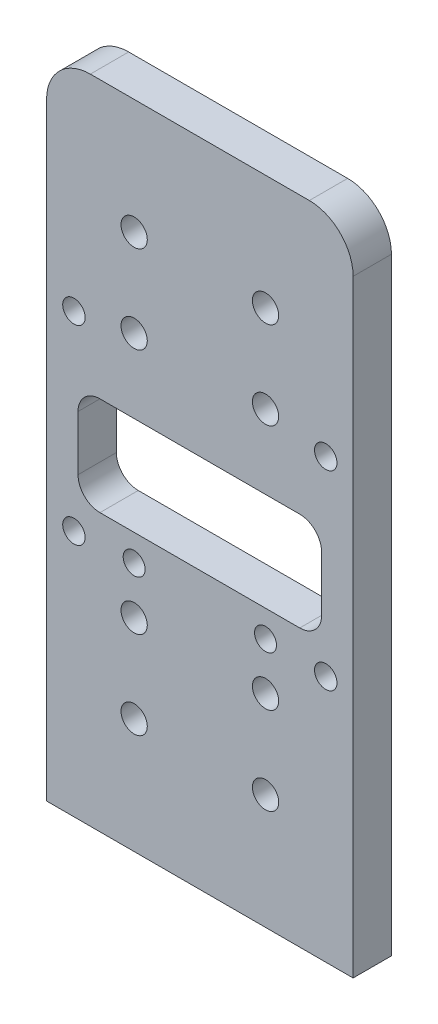
ISO-10303-21;
HEADER;
FILE_DESCRIPTION(('STEP AP214'),'2;1');
FILE_NAME('part.step','',(''),(''),'','','');
FILE_SCHEMA(('AUTOMOTIVE_DESIGN { 1 0 10303 214 1 1 1 1 }'));
ENDSEC;
DATA;
#1=APPLICATION_CONTEXT('core data for automotive mechanical design processes');
#2=APPLICATION_PROTOCOL_DEFINITION('international standard','automotive_design',2000,#1);
#3=PRODUCT_CONTEXT('',#1,'mechanical');
#4=PRODUCT('Part','Part','',(#3));
#5=PRODUCT_RELATED_PRODUCT_CATEGORY('part','',(#4));
#6=PRODUCT_DEFINITION_FORMATION('','',#4);
#7=PRODUCT_DEFINITION_CONTEXT('part definition',#1,'design');
#8=PRODUCT_DEFINITION('design','',#6,#7);
#9=PRODUCT_DEFINITION_SHAPE('','',#8);
#10=(LENGTH_UNIT() NAMED_UNIT(*) SI_UNIT(.MILLI.,.METRE.));
#11=(NAMED_UNIT(*) PLANE_ANGLE_UNIT() SI_UNIT($,.RADIAN.));
#12=(NAMED_UNIT(*) SI_UNIT($,.STERADIAN.) SOLID_ANGLE_UNIT());
#13=UNCERTAINTY_MEASURE_WITH_UNIT(LENGTH_MEASURE(1.E-05),#10,'distance_accuracy_value','');
#14=(GEOMETRIC_REPRESENTATION_CONTEXT(3) GLOBAL_UNCERTAINTY_ASSIGNED_CONTEXT((#13)) GLOBAL_UNIT_ASSIGNED_CONTEXT((#10,
#11,#12)) REPRESENTATION_CONTEXT('',''));
#15=CARTESIAN_POINT('',(0.,0.,0.));
#16=DIRECTION('',(0.,0.,1.));
#17=DIRECTION('',(1.,0.,0.));
#18=AXIS2_PLACEMENT_3D('',#15,#16,#17);
#19=CARTESIAN_POINT('',(28.,0.,3.5));
#20=DIRECTION('',(-1.,0.,0.));
#21=DIRECTION('',(0.,0.,1.));
#22=AXIS2_PLACEMENT_3D('',#19,#20,#21);
#23=PLANE('',#22);
#24=DIRECTION('',(0.,1.,0.));
#25=VECTOR('',#24,1.);
#26=CARTESIAN_POINT('',(28.,0.,0.));
#27=LINE('',#26,#25);
#28=CARTESIAN_POINT('',(28.,0.,0.));
#29=VERTEX_POINT('',#28);
#30=CARTESIAN_POINT('',(28.,55.5,0.));
#31=VERTEX_POINT('',#30);
#32=EDGE_CURVE('E275',#29,#31,#27,.T.);
#33=ORIENTED_EDGE('',*,*,#32,.T.);
#34=DIRECTION('',(0.,0.,-1.));
#35=VECTOR('',#34,1.);
#36=CARTESIAN_POINT('',(28.,55.5,3.5));
#37=LINE('',#36,#35);
#38=CARTESIAN_POINT('',(28.,55.5,3.5));
#39=VERTEX_POINT('',#38);
#40=EDGE_CURVE('E11',#39,#31,#37,.T.);
#41=ORIENTED_EDGE('',*,*,#40,.F.);
#42=DIRECTION('',(0.,1.,0.));
#43=VECTOR('',#42,1.);
#44=CARTESIAN_POINT('',(28.,0.,3.5));
#45=LINE('',#44,#43);
#46=CARTESIAN_POINT('',(28.,0.,3.5));
#47=VERTEX_POINT('',#46);
#48=EDGE_CURVE('E278',#47,#39,#45,.T.);
#49=ORIENTED_EDGE('',*,*,#48,.F.);
#50=DIRECTION('',(0.,0.,-1.));
#51=VECTOR('',#50,1.);
#52=CARTESIAN_POINT('',(28.,0.,3.5));
#53=LINE('',#52,#51);
#54=EDGE_CURVE('E292',#47,#29,#53,.T.);
#55=ORIENTED_EDGE('',*,*,#54,.T.);
#56=EDGE_LOOP('',(#33,#41,#49,#55));
#57=FACE_BOUND('',#56,.T.);
#58=ADVANCED_FACE('F33',(#57),#23,.F.);
#59=CARTESIAN_POINT('',(24.,55.5,3.5));
#60=DIRECTION('',(0.,0.,-1.));
#61=DIRECTION('',(-1.,0.,0.));
#62=AXIS2_PLACEMENT_3D('',#59,#60,#61);
#63=CYLINDRICAL_SURFACE('',#62,4.);
#64=CARTESIAN_POINT('',(24.,55.5,0.));
#65=DIRECTION('',(0.,0.,1.));
#66=DIRECTION('',(-1.,0.,0.));
#67=AXIS2_PLACEMENT_3D('',#64,#65,#66);
#68=CIRCLE('',#67,4.);
#69=CARTESIAN_POINT('',(24.,59.5,0.));
#70=VERTEX_POINT('',#69);
#71=EDGE_CURVE('E295',#31,#70,#68,.T.);
#72=ORIENTED_EDGE('',*,*,#71,.T.);
#73=DIRECTION('',(0.,0.,-1.));
#74=VECTOR('',#73,1.);
#75=CARTESIAN_POINT('',(24.,59.5,3.5));
#76=LINE('',#75,#74);
#77=CARTESIAN_POINT('',(24.,59.5,3.5));
#78=VERTEX_POINT('',#77);
#79=EDGE_CURVE('E40',#78,#70,#76,.T.);
#80=ORIENTED_EDGE('',*,*,#79,.F.);
#81=CARTESIAN_POINT('',(24.,55.5,3.5));
#82=DIRECTION('',(0.,0.,1.));
#83=DIRECTION('',(-1.,0.,0.));
#84=AXIS2_PLACEMENT_3D('',#81,#82,#83);
#85=CIRCLE('',#84,4.);
#86=EDGE_CURVE('E281',#39,#78,#85,.T.);
#87=ORIENTED_EDGE('',*,*,#86,.F.);
#88=ORIENTED_EDGE('',*,*,#40,.T.);
#89=EDGE_LOOP('',(#72,#80,#87,#88));
#90=FACE_BOUND('',#89,.T.);
#91=ADVANCED_FACE('F341',(#90),#63,.T.);
#92=CARTESIAN_POINT('',(4.00000000000003,59.5,3.5));
#93=DIRECTION('',(0.,-1.,0.));
#94=DIRECTION('',(0.,0.,-1.));
#95=AXIS2_PLACEMENT_3D('',#92,#93,#94);
#96=PLANE('',#95);
#97=DIRECTION('',(-1.,0.,0.));
#98=VECTOR('',#97,1.);
#99=CARTESIAN_POINT('',(4.00000000000003,59.5,0.));
#100=LINE('',#99,#98);
#101=CARTESIAN_POINT('',(4.00000000000003,59.5,0.));
#102=VERTEX_POINT('',#101);
#103=EDGE_CURVE('E297',#70,#102,#100,.T.);
#104=ORIENTED_EDGE('',*,*,#103,.T.);
#105=DIRECTION('',(0.,0.,-1.));
#106=VECTOR('',#105,1.);
#107=CARTESIAN_POINT('',(4.00000000000003,59.5,3.5));
#108=LINE('',#107,#106);
#109=CARTESIAN_POINT('',(4.00000000000003,59.5,3.5));
#110=VERTEX_POINT('',#109);
#111=EDGE_CURVE('E312',#110,#102,#108,.T.);
#112=ORIENTED_EDGE('',*,*,#111,.F.);
#113=DIRECTION('',(-1.,0.,0.));
#114=VECTOR('',#113,1.);
#115=CARTESIAN_POINT('',(4.00000000000003,59.5,3.5));
#116=LINE('',#115,#114);
#117=EDGE_CURVE('E284',#78,#110,#116,.T.);
#118=ORIENTED_EDGE('',*,*,#117,.F.);
#119=ORIENTED_EDGE('',*,*,#79,.T.);
#120=EDGE_LOOP('',(#104,#112,#118,#119));
#121=FACE_BOUND('',#120,.T.);
#122=ADVANCED_FACE('F319',(#121),#96,.F.);
#123=CARTESIAN_POINT('',(4.,55.5,3.5));
#124=DIRECTION('',(0.,0.,-1.));
#125=DIRECTION('',(-1.,0.,0.));
#126=AXIS2_PLACEMENT_3D('',#123,#124,#125);
#127=CYLINDRICAL_SURFACE('',#126,4.);
#128=CARTESIAN_POINT('',(4.,55.5,0.));
#129=DIRECTION('',(0.,0.,1.));
#130=DIRECTION('',(-1.,0.,0.));
#131=AXIS2_PLACEMENT_3D('',#128,#129,#130);
#132=CIRCLE('',#131,4.);
#133=CARTESIAN_POINT('',(0.,55.5,0.));
#134=VERTEX_POINT('',#133);
#135=EDGE_CURVE('E299',#102,#134,#132,.T.);
#136=ORIENTED_EDGE('',*,*,#135,.T.);
#137=DIRECTION('',(0.,0.,-1.));
#138=VECTOR('',#137,1.);
#139=CARTESIAN_POINT('',(0.,55.5,3.5));
#140=LINE('',#139,#138);
#141=CARTESIAN_POINT('',(0.,55.5,3.5));
#142=VERTEX_POINT('',#141);
#143=EDGE_CURVE('E309',#142,#134,#140,.T.);
#144=ORIENTED_EDGE('',*,*,#143,.F.);
#145=CARTESIAN_POINT('',(4.,55.5,3.5));
#146=DIRECTION('',(0.,0.,1.));
#147=DIRECTION('',(-1.,0.,0.));
#148=AXIS2_PLACEMENT_3D('',#145,#146,#147);
#149=CIRCLE('',#148,4.);
#150=EDGE_CURVE('E286',#110,#142,#149,.T.);
#151=ORIENTED_EDGE('',*,*,#150,.F.);
#152=ORIENTED_EDGE('',*,*,#111,.T.);
#153=EDGE_LOOP('',(#136,#144,#151,#152));
#154=FACE_BOUND('',#153,.T.);
#155=ADVANCED_FACE('F329',(#154),#127,.T.);
#156=CARTESIAN_POINT('',(0.,0.,3.5));
#157=DIRECTION('',(1.,0.,0.));
#158=DIRECTION('',(0.,0.,-1.));
#159=AXIS2_PLACEMENT_3D('',#156,#157,#158);
#160=PLANE('',#159);
#161=DIRECTION('',(0.,-1.,0.));
#162=VECTOR('',#161,1.);
#163=CARTESIAN_POINT('',(0.,0.,0.));
#164=LINE('',#163,#162);
#165=CARTESIAN_POINT('',(0.,0.,0.));
#166=VERTEX_POINT('',#165);
#167=EDGE_CURVE('E301',#134,#166,#164,.T.);
#168=ORIENTED_EDGE('',*,*,#167,.T.);
#169=DIRECTION('',(0.,0.,-1.));
#170=VECTOR('',#169,1.);
#171=CARTESIAN_POINT('',(0.,0.,3.5));
#172=LINE('',#171,#170);
#173=CARTESIAN_POINT('',(0.,0.,3.5));
#174=VERTEX_POINT('',#173);
#175=EDGE_CURVE('E306',#174,#166,#172,.T.);
#176=ORIENTED_EDGE('',*,*,#175,.F.);
#177=DIRECTION('',(0.,-1.,0.));
#178=VECTOR('',#177,1.);
#179=CARTESIAN_POINT('',(0.,0.,3.5));
#180=LINE('',#179,#178);
#181=EDGE_CURVE('E288',#142,#174,#180,.T.);
#182=ORIENTED_EDGE('',*,*,#181,.F.);
#183=ORIENTED_EDGE('',*,*,#143,.T.);
#184=EDGE_LOOP('',(#168,#176,#182,#183));
#185=FACE_BOUND('',#184,.T.);
#186=ADVANCED_FACE('F333',(#185),#160,.F.);
#187=CARTESIAN_POINT('',(0.,0.,3.5));
#188=DIRECTION('',(0.,1.,0.));
#189=DIRECTION('',(0.,0.,1.));
#190=AXIS2_PLACEMENT_3D('',#187,#188,#189);
#191=PLANE('',#190);
#192=DIRECTION('',(1.,0.,0.));
#193=VECTOR('',#192,1.);
#194=CARTESIAN_POINT('',(0.,0.,0.));
#195=LINE('',#194,#193);
#196=EDGE_CURVE('E282',#166,#29,#195,.T.);
#197=ORIENTED_EDGE('',*,*,#196,.T.);
#198=ORIENTED_EDGE('',*,*,#54,.F.);
#199=DIRECTION('',(1.,0.,0.));
#200=VECTOR('',#199,1.);
#201=CARTESIAN_POINT('',(0.,0.,3.5));
#202=LINE('',#201,#200);
#203=EDGE_CURVE('E290',#174,#47,#202,.T.);
#204=ORIENTED_EDGE('',*,*,#203,.F.);
#205=ORIENTED_EDGE('',*,*,#175,.T.);
#206=EDGE_LOOP('',(#197,#198,#204,#205));
#207=FACE_BOUND('',#206,.T.);
#208=ADVANCED_FACE('F344',(#207),#191,.F.);
#209=CARTESIAN_POINT('',(24.,55.5,3.5));
#210=DIRECTION('',(0.,0.,-1.));
#211=DIRECTION('',(-1.,0.,0.));
#212=AXIS2_PLACEMENT_3D('',#209,#210,#211);
#213=PLANE('',#212);
#214=CARTESIAN_POINT('',(20.,22.82,3.5));
#215=DIRECTION('',(0.,0.,1.));
#216=DIRECTION('',(1.,0.,0.));
#217=AXIS2_PLACEMENT_3D('',#214,#215,#216);
#218=CIRCLE('',#217,1.);
#219=CARTESIAN_POINT('',(21.,22.82,3.5));
#220=VERTEX_POINT('',#219);
#221=EDGE_CURVE('E616',#220,#220,#218,.T.);
#222=ORIENTED_EDGE('',*,*,#221,.F.);
#223=EDGE_LOOP('',(#222));
#224=FACE_BOUND('',#223,.T.);
#225=CARTESIAN_POINT('',(8.,22.82,3.5));
#226=DIRECTION('',(0.,0.,1.));
#227=DIRECTION('',(1.,0.,0.));
#228=AXIS2_PLACEMENT_3D('',#225,#226,#227);
#229=CIRCLE('',#228,1.);
#230=CARTESIAN_POINT('',(9.,22.82,3.5));
#231=VERTEX_POINT('',#230);
#232=EDGE_CURVE('E158',#231,#231,#229,.T.);
#233=ORIENTED_EDGE('',*,*,#232,.F.);
#234=EDGE_LOOP('',(#233));
#235=FACE_BOUND('',#234,.T.);
#236=DIRECTION('',(-1.,0.,0.));
#237=VECTOR('',#236,1.);
#238=CARTESIAN_POINT('',(4.87500000000002,34.25,3.5));
#239=LINE('',#238,#237);
#240=CARTESIAN_POINT('',(23.125,34.25,3.5));
#241=VERTEX_POINT('',#240);
#242=CARTESIAN_POINT('',(4.87500000000002,34.25,3.5));
#243=VERTEX_POINT('',#242);
#244=EDGE_CURVE('E175',#241,#243,#239,.T.);
#245=ORIENTED_EDGE('',*,*,#244,.F.);
#246=CARTESIAN_POINT('',(23.125,32.25,3.5));
#247=DIRECTION('',(0.,0.,1.));
#248=DIRECTION('',(1.,0.,0.));
#249=AXIS2_PLACEMENT_3D('',#246,#247,#248);
#250=CIRCLE('',#249,2.);
#251=CARTESIAN_POINT('',(25.125,32.25,3.5));
#252=VERTEX_POINT('',#251);
#253=EDGE_CURVE('E47',#252,#241,#250,.T.);
#254=ORIENTED_EDGE('',*,*,#253,.F.);
#255=DIRECTION('',(0.,1.,0.));
#256=VECTOR('',#255,1.);
#257=CARTESIAN_POINT('',(25.125,32.25,3.5));
#258=LINE('',#257,#256);
#259=CARTESIAN_POINT('',(25.125,27.25,3.5));
#260=VERTEX_POINT('',#259);
#261=EDGE_CURVE('E152',#260,#252,#258,.T.);
#262=ORIENTED_EDGE('',*,*,#261,.F.);
#263=CARTESIAN_POINT('',(23.125,27.25,3.5));
#264=DIRECTION('',(0.,0.,1.));
#265=DIRECTION('',(-1.,0.,0.));
#266=AXIS2_PLACEMENT_3D('',#263,#264,#265);
#267=CIRCLE('',#266,2.);
#268=CARTESIAN_POINT('',(23.125,25.25,3.5));
#269=VERTEX_POINT('',#268);
#270=EDGE_CURVE('E155',#269,#260,#267,.T.);
#271=ORIENTED_EDGE('',*,*,#270,.F.);
#272=DIRECTION('',(1.,0.,0.));
#273=VECTOR('',#272,1.);
#274=CARTESIAN_POINT('',(4.87500000000002,25.25,3.5));
#275=LINE('',#274,#273);
#276=CARTESIAN_POINT('',(4.87500000000002,25.25,3.5));
#277=VERTEX_POINT('',#276);
#278=EDGE_CURVE('E187',#277,#269,#275,.T.);
#279=ORIENTED_EDGE('',*,*,#278,.F.);
#280=CARTESIAN_POINT('',(4.87500000000001,27.25,3.5));
#281=DIRECTION('',(0.,0.,1.));
#282=DIRECTION('',(1.,0.,0.));
#283=AXIS2_PLACEMENT_3D('',#280,#281,#282);
#284=CIRCLE('',#283,2.);
#285=CARTESIAN_POINT('',(2.87500000000001,27.25,3.5));
#286=VERTEX_POINT('',#285);
#287=EDGE_CURVE('E184',#286,#277,#284,.T.);
#288=ORIENTED_EDGE('',*,*,#287,.F.);
#289=DIRECTION('',(0.,-1.,0.));
#290=VECTOR('',#289,1.);
#291=CARTESIAN_POINT('',(2.87500000000001,32.25,3.5));
#292=LINE('',#291,#290);
#293=CARTESIAN_POINT('',(2.87500000000001,32.25,3.5));
#294=VERTEX_POINT('',#293);
#295=EDGE_CURVE('E181',#294,#286,#292,.T.);
#296=ORIENTED_EDGE('',*,*,#295,.F.);
#297=CARTESIAN_POINT('',(4.87500000000001,32.25,3.5));
#298=DIRECTION('',(0.,0.,1.));
#299=DIRECTION('',(1.,0.,0.));
#300=AXIS2_PLACEMENT_3D('',#297,#298,#299);
#301=CIRCLE('',#300,2.);
#302=EDGE_CURVE('E178',#243,#294,#301,.T.);
#303=ORIENTED_EDGE('',*,*,#302,.F.);
#304=EDGE_LOOP('',(#245,#254,#262,#271,#279,#288,#296,#303));
#305=FACE_BOUND('',#304,.T.);
#306=CARTESIAN_POINT('',(20.,49.,3.5));
#307=DIRECTION('',(0.,0.,1.));
#308=DIRECTION('',(1.,0.,0.));
#309=AXIS2_PLACEMENT_3D('',#306,#307,#308);
#310=CIRCLE('',#309,1.2);
#311=CARTESIAN_POINT('',(21.2,49.,3.5));
#312=VERTEX_POINT('',#311);
#313=EDGE_CURVE('E228',#312,#312,#310,.T.);
#314=ORIENTED_EDGE('',*,*,#313,.F.);
#315=EDGE_LOOP('',(#314));
#316=FACE_BOUND('',#315,.T.);
#317=CARTESIAN_POINT('',(20.,41.,3.5));
#318=DIRECTION('',(0.,0.,1.));
#319=DIRECTION('',(1.,0.,0.));
#320=AXIS2_PLACEMENT_3D('',#317,#318,#319);
#321=CIRCLE('',#320,1.2);
#322=CARTESIAN_POINT('',(21.2,41.,3.5));
#323=VERTEX_POINT('',#322);
#324=EDGE_CURVE('E234',#323,#323,#321,.T.);
#325=ORIENTED_EDGE('',*,*,#324,.F.);
#326=EDGE_LOOP('',(#325));
#327=FACE_BOUND('',#326,.T.);
#328=CARTESIAN_POINT('',(2.5,40.,3.5));
#329=DIRECTION('',(0.,0.,1.));
#330=DIRECTION('',(1.,0.,0.));
#331=AXIS2_PLACEMENT_3D('',#328,#329,#330);
#332=CIRCLE('',#331,1.025);
#333=CARTESIAN_POINT('',(3.525,40.,3.5));
#334=VERTEX_POINT('',#333);
#335=EDGE_CURVE('E209',#334,#334,#332,.T.);
#336=ORIENTED_EDGE('',*,*,#335,.F.);
#337=EDGE_LOOP('',(#336));
#338=FACE_BOUND('',#337,.T.);
#339=CARTESIAN_POINT('',(2.50000000000001,22.6,3.5));
#340=DIRECTION('',(0.,0.,1.));
#341=DIRECTION('',(1.,0.,0.));
#342=AXIS2_PLACEMENT_3D('',#339,#340,#341);
#343=CIRCLE('',#342,1.025);
#344=CARTESIAN_POINT('',(3.52500000000001,22.6,3.5));
#345=VERTEX_POINT('',#344);
#346=EDGE_CURVE('E210',#345,#345,#343,.T.);
#347=ORIENTED_EDGE('',*,*,#346,.F.);
#348=EDGE_LOOP('',(#347));
#349=FACE_BOUND('',#348,.T.);
#350=CARTESIAN_POINT('',(25.5,40.,3.5));
#351=DIRECTION('',(0.,0.,1.));
#352=DIRECTION('',(1.,0.,0.));
#353=AXIS2_PLACEMENT_3D('',#350,#351,#352);
#354=CIRCLE('',#353,1.025);
#355=CARTESIAN_POINT('',(26.525,40.,3.5));
#356=VERTEX_POINT('',#355);
#357=EDGE_CURVE('E216',#356,#356,#354,.T.);
#358=ORIENTED_EDGE('',*,*,#357,.F.);
#359=EDGE_LOOP('',(#358));
#360=FACE_BOUND('',#359,.T.);
#361=CARTESIAN_POINT('',(25.5,22.6,3.5));
#362=DIRECTION('',(0.,0.,1.));
#363=DIRECTION('',(1.,0.,0.));
#364=AXIS2_PLACEMENT_3D('',#361,#362,#363);
#365=CIRCLE('',#364,1.025);
#366=CARTESIAN_POINT('',(26.525,22.6,3.5));
#367=VERTEX_POINT('',#366);
#368=EDGE_CURVE('E194',#367,#367,#365,.T.);
#369=ORIENTED_EDGE('',*,*,#368,.F.);
#370=EDGE_LOOP('',(#369));
#371=FACE_BOUND('',#370,.T.);
#372=CARTESIAN_POINT('',(20.,10.5,3.5));
#373=DIRECTION('',(0.,0.,1.));
#374=DIRECTION('',(1.,0.,0.));
#375=AXIS2_PLACEMENT_3D('',#372,#373,#374);
#376=CIRCLE('',#375,1.2);
#377=CARTESIAN_POINT('',(21.2,10.5,3.5));
#378=VERTEX_POINT('',#377);
#379=EDGE_CURVE('E264',#378,#378,#376,.T.);
#380=ORIENTED_EDGE('',*,*,#379,.F.);
#381=EDGE_LOOP('',(#380));
#382=FACE_BOUND('',#381,.T.);
#383=CARTESIAN_POINT('',(8.,18.5,3.5));
#384=DIRECTION('',(0.,0.,1.));
#385=DIRECTION('',(1.,0.,0.));
#386=AXIS2_PLACEMENT_3D('',#383,#384,#385);
#387=CIRCLE('',#386,1.2);
#388=CARTESIAN_POINT('',(9.2,18.5,3.5));
#389=VERTEX_POINT('',#388);
#390=EDGE_CURVE('E245',#389,#389,#387,.T.);
#391=ORIENTED_EDGE('',*,*,#390,.F.);
#392=EDGE_LOOP('',(#391));
#393=FACE_BOUND('',#392,.T.);
#394=CARTESIAN_POINT('',(20.,18.5,3.5));
#395=DIRECTION('',(0.,0.,1.));
#396=DIRECTION('',(1.,0.,0.));
#397=AXIS2_PLACEMENT_3D('',#394,#395,#396);
#398=CIRCLE('',#397,1.2);
#399=CARTESIAN_POINT('',(21.2,18.5,3.5));
#400=VERTEX_POINT('',#399);
#401=EDGE_CURVE('E246',#400,#400,#398,.T.);
#402=ORIENTED_EDGE('',*,*,#401,.F.);
#403=EDGE_LOOP('',(#402));
#404=FACE_BOUND('',#403,.T.);
#405=CARTESIAN_POINT('',(8.,49.,3.5));
#406=DIRECTION('',(0.,0.,1.));
#407=DIRECTION('',(1.,0.,0.));
#408=AXIS2_PLACEMENT_3D('',#405,#406,#407);
#409=CIRCLE('',#408,1.2);
#410=CARTESIAN_POINT('',(9.2,49.,3.5));
#411=VERTEX_POINT('',#410);
#412=EDGE_CURVE('E252',#411,#411,#409,.T.);
#413=ORIENTED_EDGE('',*,*,#412,.F.);
#414=EDGE_LOOP('',(#413));
#415=FACE_BOUND('',#414,.T.);
#416=CARTESIAN_POINT('',(8.,41.,3.5));
#417=DIRECTION('',(0.,0.,1.));
#418=DIRECTION('',(1.,0.,0.));
#419=AXIS2_PLACEMENT_3D('',#416,#417,#418);
#420=CIRCLE('',#419,1.2);
#421=CARTESIAN_POINT('',(9.2,41.,3.5));
#422=VERTEX_POINT('',#421);
#423=EDGE_CURVE('E227',#422,#422,#420,.T.);
#424=ORIENTED_EDGE('',*,*,#423,.F.);
#425=EDGE_LOOP('',(#424));
#426=FACE_BOUND('',#425,.T.);
#427=CARTESIAN_POINT('',(8.,10.5,3.5));
#428=DIRECTION('',(0.,0.,1.));
#429=DIRECTION('',(1.,0.,0.));
#430=AXIS2_PLACEMENT_3D('',#427,#428,#429);
#431=CIRCLE('',#430,1.2);
#432=CARTESIAN_POINT('',(9.2,10.5,3.5));
#433=VERTEX_POINT('',#432);
#434=EDGE_CURVE('E263',#433,#433,#431,.T.);
#435=ORIENTED_EDGE('',*,*,#434,.F.);
#436=EDGE_LOOP('',(#435));
#437=FACE_BOUND('',#436,.T.);
#438=ORIENTED_EDGE('',*,*,#48,.T.);
#439=ORIENTED_EDGE('',*,*,#86,.T.);
#440=ORIENTED_EDGE('',*,*,#117,.T.);
#441=ORIENTED_EDGE('',*,*,#150,.T.);
#442=ORIENTED_EDGE('',*,*,#181,.T.);
#443=ORIENTED_EDGE('',*,*,#203,.T.);
#444=EDGE_LOOP('',(#438,#439,#440,#441,#442,#443));
#445=FACE_BOUND('',#444,.T.);
#446=ADVANCED_FACE('F337',(#224,#235,#305,#316,#327,#338,#349,#360,#371,#382,#393,#404,#415,
#426,#437,#445),#213,.F.);
#447=CARTESIAN_POINT('',(24.,55.5,0.));
#448=DIRECTION('',(0.,0.,-1.));
#449=DIRECTION('',(-1.,0.,0.));
#450=AXIS2_PLACEMENT_3D('',#447,#448,#449);
#451=PLANE('',#450);
#452=CARTESIAN_POINT('',(20.,22.82,0.));
#453=DIRECTION('',(0.,0.,1.));
#454=DIRECTION('',(1.,0.,0.));
#455=AXIS2_PLACEMENT_3D('',#452,#453,#454);
#456=CIRCLE('',#455,1.);
#457=CARTESIAN_POINT('',(21.,22.82,0.));
#458=VERTEX_POINT('',#457);
#459=EDGE_CURVE('E613',#458,#458,#456,.T.);
#460=ORIENTED_EDGE('',*,*,#459,.T.);
#461=EDGE_LOOP('',(#460));
#462=FACE_BOUND('',#461,.T.);
#463=CARTESIAN_POINT('',(8.,22.82,0.));
#464=DIRECTION('',(0.,0.,1.));
#465=DIRECTION('',(1.,0.,0.));
#466=AXIS2_PLACEMENT_3D('',#463,#464,#465);
#467=CIRCLE('',#466,1.);
#468=CARTESIAN_POINT('',(9.,22.82,0.));
#469=VERTEX_POINT('',#468);
#470=EDGE_CURVE('E176',#469,#469,#467,.T.);
#471=ORIENTED_EDGE('',*,*,#470,.T.);
#472=EDGE_LOOP('',(#471));
#473=FACE_BOUND('',#472,.T.);
#474=CARTESIAN_POINT('',(23.125,32.25,0.));
#475=DIRECTION('',(0.,0.,1.));
#476=DIRECTION('',(1.,0.,0.));
#477=AXIS2_PLACEMENT_3D('',#474,#475,#476);
#478=CIRCLE('',#477,2.);
#479=CARTESIAN_POINT('',(25.125,32.25,0.));
#480=VERTEX_POINT('',#479);
#481=CARTESIAN_POINT('',(23.125,34.25,0.));
#482=VERTEX_POINT('',#481);
#483=EDGE_CURVE('E135',#480,#482,#478,.T.);
#484=ORIENTED_EDGE('',*,*,#483,.T.);
#485=DIRECTION('',(-1.,0.,0.));
#486=VECTOR('',#485,1.);
#487=CARTESIAN_POINT('',(4.87500000000002,34.25,0.));
#488=LINE('',#487,#486);
#489=CARTESIAN_POINT('',(4.87500000000002,34.25,0.));
#490=VERTEX_POINT('',#489);
#491=EDGE_CURVE('E144',#482,#490,#488,.T.);
#492=ORIENTED_EDGE('',*,*,#491,.T.);
#493=CARTESIAN_POINT('',(4.87500000000001,32.25,0.));
#494=DIRECTION('',(0.,0.,1.));
#495=DIRECTION('',(1.,0.,0.));
#496=AXIS2_PLACEMENT_3D('',#493,#494,#495);
#497=CIRCLE('',#496,2.);
#498=CARTESIAN_POINT('',(2.87500000000001,32.25,0.));
#499=VERTEX_POINT('',#498);
#500=EDGE_CURVE('E55',#490,#499,#497,.T.);
#501=ORIENTED_EDGE('',*,*,#500,.T.);
#502=DIRECTION('',(0.,-1.,0.));
#503=VECTOR('',#502,1.);
#504=CARTESIAN_POINT('',(2.87500000000001,32.25,0.));
#505=LINE('',#504,#503);
#506=CARTESIAN_POINT('',(2.87500000000001,27.25,0.));
#507=VERTEX_POINT('',#506);
#508=EDGE_CURVE('E162',#499,#507,#505,.T.);
#509=ORIENTED_EDGE('',*,*,#508,.T.);
#510=CARTESIAN_POINT('',(4.87500000000001,27.25,0.));
#511=DIRECTION('',(0.,0.,1.));
#512=DIRECTION('',(1.,0.,0.));
#513=AXIS2_PLACEMENT_3D('',#510,#511,#512);
#514=CIRCLE('',#513,2.);
#515=CARTESIAN_POINT('',(4.87500000000002,25.25,0.));
#516=VERTEX_POINT('',#515);
#517=EDGE_CURVE('E165',#507,#516,#514,.T.);
#518=ORIENTED_EDGE('',*,*,#517,.T.);
#519=DIRECTION('',(1.,0.,0.));
#520=VECTOR('',#519,1.);
#521=CARTESIAN_POINT('',(4.87500000000002,25.25,0.));
#522=LINE('',#521,#520);
#523=CARTESIAN_POINT('',(23.125,25.25,0.));
#524=VERTEX_POINT('',#523);
#525=EDGE_CURVE('E168',#516,#524,#522,.T.);
#526=ORIENTED_EDGE('',*,*,#525,.T.);
#527=CARTESIAN_POINT('',(23.125,27.25,0.));
#528=DIRECTION('',(0.,0.,1.));
#529=DIRECTION('',(-1.,0.,0.));
#530=AXIS2_PLACEMENT_3D('',#527,#528,#529);
#531=CIRCLE('',#530,2.);
#532=CARTESIAN_POINT('',(25.125,27.25,0.));
#533=VERTEX_POINT('',#532);
#534=EDGE_CURVE('E171',#524,#533,#531,.T.);
#535=ORIENTED_EDGE('',*,*,#534,.T.);
#536=DIRECTION('',(0.,1.,0.));
#537=VECTOR('',#536,1.);
#538=CARTESIAN_POINT('',(25.125,32.25,0.));
#539=LINE('',#538,#537);
#540=EDGE_CURVE('E141',#533,#480,#539,.T.);
#541=ORIENTED_EDGE('',*,*,#540,.T.);
#542=EDGE_LOOP('',(#484,#492,#501,#509,#518,#526,#535,#541));
#543=FACE_BOUND('',#542,.T.);
#544=CARTESIAN_POINT('',(20.,49.,0.));
#545=DIRECTION('',(0.,0.,1.));
#546=DIRECTION('',(1.,0.,0.));
#547=AXIS2_PLACEMENT_3D('',#544,#545,#546);
#548=CIRCLE('',#547,1.2);
#549=CARTESIAN_POINT('',(21.2,49.,0.));
#550=VERTEX_POINT('',#549);
#551=EDGE_CURVE('E224',#550,#550,#548,.T.);
#552=ORIENTED_EDGE('',*,*,#551,.T.);
#553=EDGE_LOOP('',(#552));
#554=FACE_BOUND('',#553,.T.);
#555=CARTESIAN_POINT('',(20.,41.,0.));
#556=DIRECTION('',(0.,0.,1.));
#557=DIRECTION('',(1.,0.,0.));
#558=AXIS2_PLACEMENT_3D('',#555,#556,#557);
#559=CIRCLE('',#558,1.2);
#560=CARTESIAN_POINT('',(21.2,41.,0.));
#561=VERTEX_POINT('',#560);
#562=EDGE_CURVE('E231',#561,#561,#559,.T.);
#563=ORIENTED_EDGE('',*,*,#562,.T.);
#564=EDGE_LOOP('',(#563));
#565=FACE_BOUND('',#564,.T.);
#566=CARTESIAN_POINT('',(2.5,40.,0.));
#567=DIRECTION('',(0.,0.,1.));
#568=DIRECTION('',(1.,0.,0.));
#569=AXIS2_PLACEMENT_3D('',#566,#567,#568);
#570=CIRCLE('',#569,1.025);
#571=CARTESIAN_POINT('',(3.525,40.,0.));
#572=VERTEX_POINT('',#571);
#573=EDGE_CURVE('E237',#572,#572,#570,.T.);
#574=ORIENTED_EDGE('',*,*,#573,.T.);
#575=EDGE_LOOP('',(#574));
#576=FACE_BOUND('',#575,.T.);
#577=CARTESIAN_POINT('',(2.50000000000001,22.6,0.));
#578=DIRECTION('',(0.,0.,1.));
#579=DIRECTION('',(1.,0.,0.));
#580=AXIS2_PLACEMENT_3D('',#577,#578,#579);
#581=CIRCLE('',#580,1.025);
#582=CARTESIAN_POINT('',(3.52500000000001,22.6,0.));
#583=VERTEX_POINT('',#582);
#584=EDGE_CURVE('E206',#583,#583,#581,.T.);
#585=ORIENTED_EDGE('',*,*,#584,.T.);
#586=EDGE_LOOP('',(#585));
#587=FACE_BOUND('',#586,.T.);
#588=CARTESIAN_POINT('',(25.5,40.,0.));
#589=DIRECTION('',(0.,0.,1.));
#590=DIRECTION('',(1.,0.,0.));
#591=AXIS2_PLACEMENT_3D('',#588,#589,#590);
#592=CIRCLE('',#591,1.025);
#593=CARTESIAN_POINT('',(26.525,40.,0.));
#594=VERTEX_POINT('',#593);
#595=EDGE_CURVE('E213',#594,#594,#592,.T.);
#596=ORIENTED_EDGE('',*,*,#595,.T.);
#597=EDGE_LOOP('',(#596));
#598=FACE_BOUND('',#597,.T.);
#599=CARTESIAN_POINT('',(25.5,22.6,0.));
#600=DIRECTION('',(0.,0.,1.));
#601=DIRECTION('',(1.,0.,0.));
#602=AXIS2_PLACEMENT_3D('',#599,#600,#601);
#603=CIRCLE('',#602,1.025);
#604=CARTESIAN_POINT('',(26.525,22.6,0.));
#605=VERTEX_POINT('',#604);
#606=EDGE_CURVE('E219',#605,#605,#603,.T.);
#607=ORIENTED_EDGE('',*,*,#606,.T.);
#608=EDGE_LOOP('',(#607));
#609=FACE_BOUND('',#608,.T.);
#610=CARTESIAN_POINT('',(20.,10.5,0.));
#611=DIRECTION('',(0.,0.,1.));
#612=DIRECTION('',(1.,0.,0.));
#613=AXIS2_PLACEMENT_3D('',#610,#611,#612);
#614=CIRCLE('',#613,1.2);
#615=CARTESIAN_POINT('',(21.2,10.5,0.));
#616=VERTEX_POINT('',#615);
#617=EDGE_CURVE('E260',#616,#616,#614,.T.);
#618=ORIENTED_EDGE('',*,*,#617,.T.);
#619=EDGE_LOOP('',(#618));
#620=FACE_BOUND('',#619,.T.);
#621=CARTESIAN_POINT('',(8.,18.5,0.));
#622=DIRECTION('',(0.,0.,1.));
#623=DIRECTION('',(1.,0.,0.));
#624=AXIS2_PLACEMENT_3D('',#621,#622,#623);
#625=CIRCLE('',#624,1.2);
#626=CARTESIAN_POINT('',(9.2,18.5,0.));
#627=VERTEX_POINT('',#626);
#628=EDGE_CURVE('E267',#627,#627,#625,.T.);
#629=ORIENTED_EDGE('',*,*,#628,.T.);
#630=EDGE_LOOP('',(#629));
#631=FACE_BOUND('',#630,.T.);
#632=CARTESIAN_POINT('',(20.,18.5,0.));
#633=DIRECTION('',(0.,0.,1.));
#634=DIRECTION('',(1.,0.,0.));
#635=AXIS2_PLACEMENT_3D('',#632,#633,#634);
#636=CIRCLE('',#635,1.2);
#637=CARTESIAN_POINT('',(21.2,18.5,0.));
#638=VERTEX_POINT('',#637);
#639=EDGE_CURVE('E242',#638,#638,#636,.T.);
#640=ORIENTED_EDGE('',*,*,#639,.T.);
#641=EDGE_LOOP('',(#640));
#642=FACE_BOUND('',#641,.T.);
#643=CARTESIAN_POINT('',(8.,49.,0.));
#644=DIRECTION('',(0.,0.,1.));
#645=DIRECTION('',(1.,0.,0.));
#646=AXIS2_PLACEMENT_3D('',#643,#644,#645);
#647=CIRCLE('',#646,1.2);
#648=CARTESIAN_POINT('',(9.2,49.,0.));
#649=VERTEX_POINT('',#648);
#650=EDGE_CURVE('E249',#649,#649,#647,.T.);
#651=ORIENTED_EDGE('',*,*,#650,.T.);
#652=EDGE_LOOP('',(#651));
#653=FACE_BOUND('',#652,.T.);
#654=CARTESIAN_POINT('',(8.,41.,0.));
#655=DIRECTION('',(0.,0.,1.));
#656=DIRECTION('',(1.,0.,0.));
#657=AXIS2_PLACEMENT_3D('',#654,#655,#656);
#658=CIRCLE('',#657,1.2);
#659=CARTESIAN_POINT('',(9.2,41.,0.));
#660=VERTEX_POINT('',#659);
#661=EDGE_CURVE('E255',#660,#660,#658,.T.);
#662=ORIENTED_EDGE('',*,*,#661,.T.);
#663=EDGE_LOOP('',(#662));
#664=FACE_BOUND('',#663,.T.);
#665=CARTESIAN_POINT('',(8.,10.5,0.));
#666=DIRECTION('',(0.,0.,1.));
#667=DIRECTION('',(1.,0.,0.));
#668=AXIS2_PLACEMENT_3D('',#665,#666,#667);
#669=CIRCLE('',#668,1.2);
#670=CARTESIAN_POINT('',(9.2,10.5,0.));
#671=VERTEX_POINT('',#670);
#672=EDGE_CURVE('E272',#671,#671,#669,.T.);
#673=ORIENTED_EDGE('',*,*,#672,.T.);
#674=EDGE_LOOP('',(#673));
#675=FACE_BOUND('',#674,.T.);
#676=ORIENTED_EDGE('',*,*,#32,.F.);
#677=ORIENTED_EDGE('',*,*,#196,.F.);
#678=ORIENTED_EDGE('',*,*,#167,.F.);
#679=ORIENTED_EDGE('',*,*,#135,.F.);
#680=ORIENTED_EDGE('',*,*,#103,.F.);
#681=ORIENTED_EDGE('',*,*,#71,.F.);
#682=EDGE_LOOP('',(#676,#677,#678,#679,#680,#681));
#683=FACE_BOUND('',#682,.T.);
#684=ADVANCED_FACE('F148',(#462,#473,#543,#554,#565,#576,#587,#598,#609,#620,#631,#642,#653,
#664,#675,#683),#451,.T.);
#685=CARTESIAN_POINT('',(8.,10.5,0.));
#686=DIRECTION('',(0.,0.,1.));
#687=DIRECTION('',(1.,0.,0.));
#688=AXIS2_PLACEMENT_3D('',#685,#686,#687);
#689=CYLINDRICAL_SURFACE('',#688,1.2);
#690=ORIENTED_EDGE('',*,*,#672,.F.);
#691=EDGE_LOOP('',(#690));
#692=FACE_BOUND('',#691,.T.);
#693=ORIENTED_EDGE('',*,*,#434,.T.);
#694=EDGE_LOOP('',(#693));
#695=FACE_BOUND('',#694,.T.);
#696=ADVANCED_FACE('F383',(#692,#695),#689,.F.);
#697=CARTESIAN_POINT('',(8.,41.,0.));
#698=DIRECTION('',(0.,0.,1.));
#699=DIRECTION('',(1.,0.,0.));
#700=AXIS2_PLACEMENT_3D('',#697,#698,#699);
#701=CYLINDRICAL_SURFACE('',#700,1.2);
#702=ORIENTED_EDGE('',*,*,#661,.F.);
#703=EDGE_LOOP('',(#702));
#704=FACE_BOUND('',#703,.T.);
#705=ORIENTED_EDGE('',*,*,#423,.T.);
#706=EDGE_LOOP('',(#705));
#707=FACE_BOUND('',#706,.T.);
#708=ADVANCED_FACE('F388',(#704,#707),#701,.F.);
#709=CARTESIAN_POINT('',(8.,49.,0.));
#710=DIRECTION('',(0.,0.,1.));
#711=DIRECTION('',(1.,0.,0.));
#712=AXIS2_PLACEMENT_3D('',#709,#710,#711);
#713=CYLINDRICAL_SURFACE('',#712,1.2);
#714=ORIENTED_EDGE('',*,*,#650,.F.);
#715=EDGE_LOOP('',(#714));
#716=FACE_BOUND('',#715,.T.);
#717=ORIENTED_EDGE('',*,*,#412,.T.);
#718=EDGE_LOOP('',(#717));
#719=FACE_BOUND('',#718,.T.);
#720=ADVANCED_FACE('F400',(#716,#719),#713,.F.);
#721=CARTESIAN_POINT('',(20.,18.5,0.));
#722=DIRECTION('',(0.,0.,1.));
#723=DIRECTION('',(1.,0.,0.));
#724=AXIS2_PLACEMENT_3D('',#721,#722,#723);
#725=CYLINDRICAL_SURFACE('',#724,1.2);
#726=ORIENTED_EDGE('',*,*,#639,.F.);
#727=EDGE_LOOP('',(#726));
#728=FACE_BOUND('',#727,.T.);
#729=ORIENTED_EDGE('',*,*,#401,.T.);
#730=EDGE_LOOP('',(#729));
#731=FACE_BOUND('',#730,.T.);
#732=ADVANCED_FACE('F410',(#728,#731),#725,.F.);
#733=CARTESIAN_POINT('',(8.,18.5,0.));
#734=DIRECTION('',(0.,0.,1.));
#735=DIRECTION('',(1.,0.,0.));
#736=AXIS2_PLACEMENT_3D('',#733,#734,#735);
#737=CYLINDRICAL_SURFACE('',#736,1.2);
#738=ORIENTED_EDGE('',*,*,#628,.F.);
#739=EDGE_LOOP('',(#738));
#740=FACE_BOUND('',#739,.T.);
#741=ORIENTED_EDGE('',*,*,#390,.T.);
#742=EDGE_LOOP('',(#741));
#743=FACE_BOUND('',#742,.T.);
#744=ADVANCED_FACE('F420',(#740,#743),#737,.F.);
#745=CARTESIAN_POINT('',(20.,10.5,0.));
#746=DIRECTION('',(0.,0.,1.));
#747=DIRECTION('',(1.,0.,0.));
#748=AXIS2_PLACEMENT_3D('',#745,#746,#747);
#749=CYLINDRICAL_SURFACE('',#748,1.2);
#750=ORIENTED_EDGE('',*,*,#617,.F.);
#751=EDGE_LOOP('',(#750));
#752=FACE_BOUND('',#751,.T.);
#753=ORIENTED_EDGE('',*,*,#379,.T.);
#754=EDGE_LOOP('',(#753));
#755=FACE_BOUND('',#754,.T.);
#756=ADVANCED_FACE('F430',(#752,#755),#749,.F.);
#757=CARTESIAN_POINT('',(25.5,22.6,0.));
#758=DIRECTION('',(0.,0.,1.));
#759=DIRECTION('',(1.,0.,0.));
#760=AXIS2_PLACEMENT_3D('',#757,#758,#759);
#761=CYLINDRICAL_SURFACE('',#760,1.025);
#762=ORIENTED_EDGE('',*,*,#606,.F.);
#763=EDGE_LOOP('',(#762));
#764=FACE_BOUND('',#763,.T.);
#765=ORIENTED_EDGE('',*,*,#368,.T.);
#766=EDGE_LOOP('',(#765));
#767=FACE_BOUND('',#766,.T.);
#768=ADVANCED_FACE('F440',(#764,#767),#761,.F.);
#769=CARTESIAN_POINT('',(25.5,40.,0.));
#770=DIRECTION('',(0.,0.,1.));
#771=DIRECTION('',(1.,0.,0.));
#772=AXIS2_PLACEMENT_3D('',#769,#770,#771);
#773=CYLINDRICAL_SURFACE('',#772,1.025);
#774=ORIENTED_EDGE('',*,*,#595,.F.);
#775=EDGE_LOOP('',(#774));
#776=FACE_BOUND('',#775,.T.);
#777=ORIENTED_EDGE('',*,*,#357,.T.);
#778=EDGE_LOOP('',(#777));
#779=FACE_BOUND('',#778,.T.);
#780=ADVANCED_FACE('F450',(#776,#779),#773,.F.);
#781=CARTESIAN_POINT('',(2.50000000000001,22.6,0.));
#782=DIRECTION('',(0.,0.,1.));
#783=DIRECTION('',(1.,0.,0.));
#784=AXIS2_PLACEMENT_3D('',#781,#782,#783);
#785=CYLINDRICAL_SURFACE('',#784,1.025);
#786=ORIENTED_EDGE('',*,*,#584,.F.);
#787=EDGE_LOOP('',(#786));
#788=FACE_BOUND('',#787,.T.);
#789=ORIENTED_EDGE('',*,*,#346,.T.);
#790=EDGE_LOOP('',(#789));
#791=FACE_BOUND('',#790,.T.);
#792=ADVANCED_FACE('F460',(#788,#791),#785,.F.);
#793=CARTESIAN_POINT('',(2.5,40.,0.));
#794=DIRECTION('',(0.,0.,1.));
#795=DIRECTION('',(1.,0.,0.));
#796=AXIS2_PLACEMENT_3D('',#793,#794,#795);
#797=CYLINDRICAL_SURFACE('',#796,1.025);
#798=ORIENTED_EDGE('',*,*,#573,.F.);
#799=EDGE_LOOP('',(#798));
#800=FACE_BOUND('',#799,.T.);
#801=ORIENTED_EDGE('',*,*,#335,.T.);
#802=EDGE_LOOP('',(#801));
#803=FACE_BOUND('',#802,.T.);
#804=ADVANCED_FACE('F470',(#800,#803),#797,.F.);
#805=CARTESIAN_POINT('',(20.,41.,0.));
#806=DIRECTION('',(0.,0.,1.));
#807=DIRECTION('',(1.,0.,0.));
#808=AXIS2_PLACEMENT_3D('',#805,#806,#807);
#809=CYLINDRICAL_SURFACE('',#808,1.2);
#810=ORIENTED_EDGE('',*,*,#562,.F.);
#811=EDGE_LOOP('',(#810));
#812=FACE_BOUND('',#811,.T.);
#813=ORIENTED_EDGE('',*,*,#324,.T.);
#814=EDGE_LOOP('',(#813));
#815=FACE_BOUND('',#814,.T.);
#816=ADVANCED_FACE('F480',(#812,#815),#809,.F.);
#817=CARTESIAN_POINT('',(20.,49.,0.));
#818=DIRECTION('',(0.,0.,1.));
#819=DIRECTION('',(1.,0.,0.));
#820=AXIS2_PLACEMENT_3D('',#817,#818,#819);
#821=CYLINDRICAL_SURFACE('',#820,1.2);
#822=ORIENTED_EDGE('',*,*,#551,.F.);
#823=EDGE_LOOP('',(#822));
#824=FACE_BOUND('',#823,.T.);
#825=ORIENTED_EDGE('',*,*,#313,.T.);
#826=EDGE_LOOP('',(#825));
#827=FACE_BOUND('',#826,.T.);
#828=ADVANCED_FACE('F490',(#824,#827),#821,.F.);
#829=CARTESIAN_POINT('',(23.125,32.25,0.));
#830=DIRECTION('',(0.,0.,1.));
#831=DIRECTION('',(1.,0.,0.));
#832=AXIS2_PLACEMENT_3D('',#829,#830,#831);
#833=CYLINDRICAL_SURFACE('',#832,2.);
#834=ORIENTED_EDGE('',*,*,#253,.T.);
#835=DIRECTION('',(0.,0.,1.));
#836=VECTOR('',#835,1.);
#837=CARTESIAN_POINT('',(23.125,34.25,0.));
#838=LINE('',#837,#836);
#839=EDGE_CURVE('E131',#482,#241,#838,.T.);
#840=ORIENTED_EDGE('',*,*,#839,.F.);
#841=ORIENTED_EDGE('',*,*,#483,.F.);
#842=DIRECTION('',(0.,0.,1.));
#843=VECTOR('',#842,1.);
#844=CARTESIAN_POINT('',(25.125,32.25,0.));
#845=LINE('',#844,#843);
#846=EDGE_CURVE('E192',#480,#252,#845,.T.);
#847=ORIENTED_EDGE('',*,*,#846,.T.);
#848=EDGE_LOOP('',(#834,#840,#841,#847));
#849=FACE_BOUND('',#848,.T.);
#850=ADVANCED_FACE('F133',(#849),#833,.F.);
#851=CARTESIAN_POINT('',(25.125,32.25,0.));
#852=DIRECTION('',(1.,0.,0.));
#853=DIRECTION('',(0.,0.,-1.));
#854=AXIS2_PLACEMENT_3D('',#851,#852,#853);
#855=PLANE('',#854);
#856=ORIENTED_EDGE('',*,*,#261,.T.);
#857=ORIENTED_EDGE('',*,*,#846,.F.);
#858=ORIENTED_EDGE('',*,*,#540,.F.);
#859=DIRECTION('',(0.,0.,1.));
#860=VECTOR('',#859,1.);
#861=CARTESIAN_POINT('',(25.125,27.25,0.));
#862=LINE('',#861,#860);
#863=EDGE_CURVE('E195',#533,#260,#862,.T.);
#864=ORIENTED_EDGE('',*,*,#863,.T.);
#865=EDGE_LOOP('',(#856,#857,#858,#864));
#866=FACE_BOUND('',#865,.T.);
#867=ADVANCED_FACE('F509',(#866),#855,.F.);
#868=CARTESIAN_POINT('',(23.125,27.25,0.));
#869=DIRECTION('',(0.,0.,1.));
#870=DIRECTION('',(1.,0.,0.));
#871=AXIS2_PLACEMENT_3D('',#868,#869,#870);
#872=CYLINDRICAL_SURFACE('',#871,2.);
#873=ORIENTED_EDGE('',*,*,#270,.T.);
#874=ORIENTED_EDGE('',*,*,#863,.F.);
#875=ORIENTED_EDGE('',*,*,#534,.F.);
#876=DIRECTION('',(0.,0.,1.));
#877=VECTOR('',#876,1.);
#878=CARTESIAN_POINT('',(23.125,25.25,0.));
#879=LINE('',#878,#877);
#880=EDGE_CURVE('E197',#524,#269,#879,.T.);
#881=ORIENTED_EDGE('',*,*,#880,.T.);
#882=EDGE_LOOP('',(#873,#874,#875,#881));
#883=FACE_BOUND('',#882,.T.);
#884=ADVANCED_FACE('F518',(#883),#872,.F.);
#885=CARTESIAN_POINT('',(4.87500000000002,25.25,0.));
#886=DIRECTION('',(0.,-1.,0.));
#887=DIRECTION('',(1.,0.,0.));
#888=AXIS2_PLACEMENT_3D('',#885,#886,#887);
#889=PLANE('',#888);
#890=ORIENTED_EDGE('',*,*,#278,.T.);
#891=ORIENTED_EDGE('',*,*,#880,.F.);
#892=ORIENTED_EDGE('',*,*,#525,.F.);
#893=DIRECTION('',(0.,0.,1.));
#894=VECTOR('',#893,1.);
#895=CARTESIAN_POINT('',(4.87500000000002,25.25,0.));
#896=LINE('',#895,#894);
#897=EDGE_CURVE('E199',#516,#277,#896,.T.);
#898=ORIENTED_EDGE('',*,*,#897,.T.);
#899=EDGE_LOOP('',(#890,#891,#892,#898));
#900=FACE_BOUND('',#899,.T.);
#901=ADVANCED_FACE('F528',(#900),#889,.F.);
#902=CARTESIAN_POINT('',(4.87500000000001,27.25,0.));
#903=DIRECTION('',(0.,0.,1.));
#904=DIRECTION('',(1.,0.,0.));
#905=AXIS2_PLACEMENT_3D('',#902,#903,#904);
#906=CYLINDRICAL_SURFACE('',#905,2.);
#907=ORIENTED_EDGE('',*,*,#287,.T.);
#908=ORIENTED_EDGE('',*,*,#897,.F.);
#909=ORIENTED_EDGE('',*,*,#517,.F.);
#910=DIRECTION('',(0.,0.,1.));
#911=VECTOR('',#910,1.);
#912=CARTESIAN_POINT('',(2.87500000000001,27.25,0.));
#913=LINE('',#912,#911);
#914=EDGE_CURVE('E201',#507,#286,#913,.T.);
#915=ORIENTED_EDGE('',*,*,#914,.T.);
#916=EDGE_LOOP('',(#907,#908,#909,#915));
#917=FACE_BOUND('',#916,.T.);
#918=ADVANCED_FACE('F538',(#917),#906,.F.);
#919=CARTESIAN_POINT('',(2.87500000000001,32.25,0.));
#920=DIRECTION('',(-1.,0.,0.));
#921=DIRECTION('',(0.,-1.,0.));
#922=AXIS2_PLACEMENT_3D('',#919,#920,#921);
#923=PLANE('',#922);
#924=ORIENTED_EDGE('',*,*,#295,.T.);
#925=ORIENTED_EDGE('',*,*,#914,.F.);
#926=ORIENTED_EDGE('',*,*,#508,.F.);
#927=DIRECTION('',(0.,0.,1.));
#928=VECTOR('',#927,1.);
#929=CARTESIAN_POINT('',(2.87500000000001,32.25,0.));
#930=LINE('',#929,#928);
#931=EDGE_CURVE('E203',#499,#294,#930,.T.);
#932=ORIENTED_EDGE('',*,*,#931,.T.);
#933=EDGE_LOOP('',(#924,#925,#926,#932));
#934=FACE_BOUND('',#933,.T.);
#935=ADVANCED_FACE('F548',(#934),#923,.F.);
#936=CARTESIAN_POINT('',(4.87500000000001,32.25,0.));
#937=DIRECTION('',(0.,0.,1.));
#938=DIRECTION('',(1.,0.,0.));
#939=AXIS2_PLACEMENT_3D('',#936,#937,#938);
#940=CYLINDRICAL_SURFACE('',#939,2.);
#941=ORIENTED_EDGE('',*,*,#302,.T.);
#942=ORIENTED_EDGE('',*,*,#931,.F.);
#943=ORIENTED_EDGE('',*,*,#500,.F.);
#944=DIRECTION('',(0.,0.,1.));
#945=VECTOR('',#944,1.);
#946=CARTESIAN_POINT('',(4.87500000000002,34.25,0.));
#947=LINE('',#946,#945);
#948=EDGE_CURVE('E140',#490,#243,#947,.T.);
#949=ORIENTED_EDGE('',*,*,#948,.T.);
#950=EDGE_LOOP('',(#941,#942,#943,#949));
#951=FACE_BOUND('',#950,.T.);
#952=ADVANCED_FACE('F558',(#951),#940,.F.);
#953=CARTESIAN_POINT('',(4.87500000000002,34.25,0.));
#954=DIRECTION('',(0.,1.,0.));
#955=DIRECTION('',(0.,0.,1.));
#956=AXIS2_PLACEMENT_3D('',#953,#954,#955);
#957=PLANE('',#956);
#958=ORIENTED_EDGE('',*,*,#244,.T.);
#959=ORIENTED_EDGE('',*,*,#948,.F.);
#960=ORIENTED_EDGE('',*,*,#491,.F.);
#961=ORIENTED_EDGE('',*,*,#839,.T.);
#962=EDGE_LOOP('',(#958,#959,#960,#961));
#963=FACE_BOUND('',#962,.T.);
#964=ADVANCED_FACE('F145',(#963),#957,.F.);
#965=CARTESIAN_POINT('',(8.,22.82,0.));
#966=DIRECTION('',(0.,0.,1.));
#967=DIRECTION('',(1.,0.,0.));
#968=AXIS2_PLACEMENT_3D('',#965,#966,#967);
#969=CYLINDRICAL_SURFACE('',#968,1.);
#970=ORIENTED_EDGE('',*,*,#470,.F.);
#971=EDGE_LOOP('',(#970));
#972=FACE_BOUND('',#971,.T.);
#973=ORIENTED_EDGE('',*,*,#232,.T.);
#974=EDGE_LOOP('',(#973));
#975=FACE_BOUND('',#974,.T.);
#976=ADVANCED_FACE('F576',(#972,#975),#969,.F.);
#977=CARTESIAN_POINT('',(20.,22.82,0.));
#978=DIRECTION('',(0.,0.,1.));
#979=DIRECTION('',(1.,0.,0.));
#980=AXIS2_PLACEMENT_3D('',#977,#978,#979);
#981=CYLINDRICAL_SURFACE('',#980,1.);
#982=ORIENTED_EDGE('',*,*,#459,.F.);
#983=EDGE_LOOP('',(#982));
#984=FACE_BOUND('',#983,.T.);
#985=ORIENTED_EDGE('',*,*,#221,.T.);
#986=EDGE_LOOP('',(#985));
#987=FACE_BOUND('',#986,.T.);
#988=ADVANCED_FACE('F596',(#984,#987),#981,.F.);
#989=CLOSED_SHELL('',(#58,#91,#122,#155,#186,#208,#446,#684,#696,#708,#720,#732,#744,#756,#768,
#780,#792,#804,#816,#828,#850,#867,#884,#901,#918,#935,#952,#964,#976,#988));
#990=MANIFOLD_SOLID_BREP('B2',#989);
#991=ADVANCED_BREP_SHAPE_REPRESENTATION('',(#18,#990),#14);
#992=SHAPE_DEFINITION_REPRESENTATION(#9,#991);
ENDSEC;
END-ISO-10303-21;
